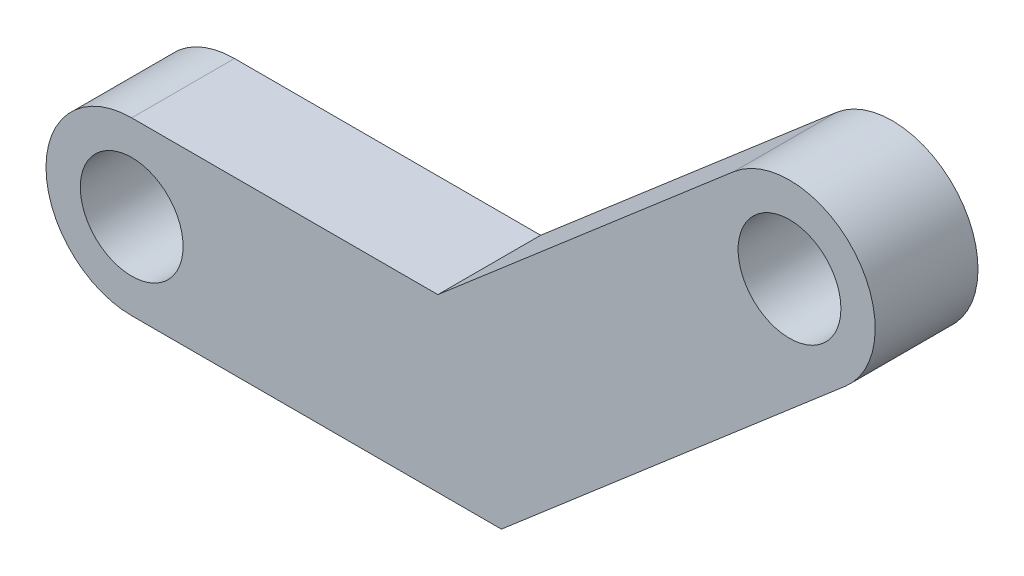
ISO-10303-21;
HEADER;
FILE_DESCRIPTION(('STEP AP214'),'2;1');
FILE_NAME('part.step','',(''),(''),'','','');
FILE_SCHEMA(('AUTOMOTIVE_DESIGN { 1 0 10303 214 1 1 1 1 }'));
ENDSEC;
DATA;
#1=APPLICATION_CONTEXT('core data for automotive mechanical design processes');
#2=APPLICATION_PROTOCOL_DEFINITION('international standard','automotive_design',2000,#1);
#3=PRODUCT_CONTEXT('',#1,'mechanical');
#4=PRODUCT('Part','Part','',(#3));
#5=PRODUCT_RELATED_PRODUCT_CATEGORY('part','',(#4));
#6=PRODUCT_DEFINITION_FORMATION('','',#4);
#7=PRODUCT_DEFINITION_CONTEXT('part definition',#1,'design');
#8=PRODUCT_DEFINITION('design','',#6,#7);
#9=PRODUCT_DEFINITION_SHAPE('','',#8);
#10=(LENGTH_UNIT() NAMED_UNIT(*) SI_UNIT(.MILLI.,.METRE.));
#11=(NAMED_UNIT(*) PLANE_ANGLE_UNIT() SI_UNIT($,.RADIAN.));
#12=(NAMED_UNIT(*) SI_UNIT($,.STERADIAN.) SOLID_ANGLE_UNIT());
#13=UNCERTAINTY_MEASURE_WITH_UNIT(LENGTH_MEASURE(1.E-05),#10,'distance_accuracy_value','');
#14=(GEOMETRIC_REPRESENTATION_CONTEXT(3) GLOBAL_UNCERTAINTY_ASSIGNED_CONTEXT((#13)) GLOBAL_UNIT_ASSIGNED_CONTEXT((#10,
#11,#12)) REPRESENTATION_CONTEXT('',''));
#15=CARTESIAN_POINT('',(0.,0.,0.));
#16=DIRECTION('',(0.,0.,1.));
#17=DIRECTION('',(1.,0.,0.));
#18=AXIS2_PLACEMENT_3D('',#15,#16,#17);
#19=CARTESIAN_POINT('',(3.87773986725271,0.,3.));
#20=DIRECTION('',(0.,0.,-1.));
#21=DIRECTION('',(-1.,0.,0.));
#22=AXIS2_PLACEMENT_3D('',#19,#20,#21);
#23=PLANE('',#22);
#24=CARTESIAN_POINT('',(3.87773986725271,0.,3.));
#25=DIRECTION('',(0.,0.,1.));
#26=DIRECTION('',(-1.,0.,0.));
#27=AXIS2_PLACEMENT_3D('',#24,#25,#26);
#28=CIRCLE('',#27,2.5);
#29=CARTESIAN_POINT('',(3.87773986725271,2.5,3.));
#30=VERTEX_POINT('',#29);
#31=CARTESIAN_POINT('',(3.87773986725271,-2.5,3.));
#32=VERTEX_POINT('',#31);
#33=EDGE_CURVE('E131',#30,#32,#28,.T.);
#34=ORIENTED_EDGE('',*,*,#33,.T.);
#35=DIRECTION('',(1.,0.,0.));
#36=VECTOR('',#35,1.);
#37=CARTESIAN_POINT('',(3.87773986725271,-2.5,3.));
#38=LINE('',#37,#36);
#39=CARTESIAN_POINT('',(14.6647507661521,-2.5,3.));
#40=VERTEX_POINT('',#39);
#41=EDGE_CURVE('E89',#32,#40,#38,.T.);
#42=ORIENTED_EDGE('',*,*,#41,.T.);
#43=DIRECTION('',(0.758248137291966,0.651966074495648,0.));
#44=VECTOR('',#43,1.);
#45=CARTESIAN_POINT('',(14.6647507661521,-2.5,3.));
#46=LINE('',#45,#44);
#47=CARTESIAN_POINT('',(24.7016896235559,6.13008203381151,3.));
#48=VERTEX_POINT('',#47);
#49=EDGE_CURVE('E102',#40,#48,#46,.T.);
#50=ORIENTED_EDGE('',*,*,#49,.T.);
#51=CARTESIAN_POINT('',(23.0717744373168,8.02570237704142,3.));
#52=DIRECTION('',(0.,0.,1.));
#53=DIRECTION('',(1.,0.,0.));
#54=AXIS2_PLACEMENT_3D('',#51,#52,#53);
#55=CIRCLE('',#54,2.5);
#56=CARTESIAN_POINT('',(21.4418592510777,9.92132272027134,3.));
#57=VERTEX_POINT('',#56);
#58=EDGE_CURVE('E96',#48,#57,#55,.T.);
#59=ORIENTED_EDGE('',*,*,#58,.T.);
#60=DIRECTION('',(-0.758248137291966,-0.651966074495647,0.));
#61=VECTOR('',#60,1.);
#62=CARTESIAN_POINT('',(12.8107289683534,2.5,3.));
#63=LINE('',#62,#61);
#64=CARTESIAN_POINT('',(12.8107289683534,2.5,3.));
#65=VERTEX_POINT('',#64);
#66=EDGE_CURVE('E100',#57,#65,#63,.T.);
#67=ORIENTED_EDGE('',*,*,#66,.T.);
#68=DIRECTION('',(-1.,0.,0.));
#69=VECTOR('',#68,1.);
#70=CARTESIAN_POINT('',(3.87773986725271,2.5,3.));
#71=LINE('',#70,#69);
#72=EDGE_CURVE('E52',#65,#30,#71,.T.);
#73=ORIENTED_EDGE('',*,*,#72,.T.);
#74=EDGE_LOOP('',(#34,#42,#50,#59,#67,#73));
#75=FACE_BOUND('',#74,.T.);
#76=CARTESIAN_POINT('',(23.0717744373168,8.02570237704142,3.));
#77=DIRECTION('',(0.,0.,1.));
#78=DIRECTION('',(1.,0.,0.));
#79=AXIS2_PLACEMENT_3D('',#76,#77,#78);
#80=CIRCLE('',#79,1.5);
#81=CARTESIAN_POINT('',(24.5717744373168,8.02570237704142,3.));
#82=VERTEX_POINT('',#81);
#83=EDGE_CURVE('E124',#82,#82,#80,.T.);
#84=ORIENTED_EDGE('',*,*,#83,.F.);
#85=EDGE_LOOP('',(#84));
#86=FACE_BOUND('',#85,.T.);
#87=CARTESIAN_POINT('',(3.87773986725271,0.,3.));
#88=DIRECTION('',(0.,0.,1.));
#89=DIRECTION('',(1.,0.,0.));
#90=AXIS2_PLACEMENT_3D('',#87,#88,#89);
#91=CIRCLE('',#90,1.5);
#92=CARTESIAN_POINT('',(5.37773986725271,0.,3.));
#93=VERTEX_POINT('',#92);
#94=EDGE_CURVE('E172',#93,#93,#91,.T.);
#95=ORIENTED_EDGE('',*,*,#94,.F.);
#96=EDGE_LOOP('',(#95));
#97=FACE_BOUND('',#96,.T.);
#98=ADVANCED_FACE('F35',(#75,#86,#97),#23,.F.);
#99=CARTESIAN_POINT('',(3.87773986725271,0.,0.));
#100=DIRECTION('',(0.,0.,-1.));
#101=DIRECTION('',(-1.,0.,0.));
#102=AXIS2_PLACEMENT_3D('',#99,#100,#101);
#103=PLANE('',#102);
#104=CARTESIAN_POINT('',(23.0717744373168,8.02570237704142,0.));
#105=DIRECTION('',(0.,0.,1.));
#106=DIRECTION('',(1.,0.,0.));
#107=AXIS2_PLACEMENT_3D('',#104,#105,#106);
#108=CIRCLE('',#107,1.5);
#109=CARTESIAN_POINT('',(24.5717744373168,8.02570237704142,0.));
#110=VERTEX_POINT('',#109);
#111=EDGE_CURVE('E177',#110,#110,#108,.T.);
#112=ORIENTED_EDGE('',*,*,#111,.T.);
#113=EDGE_LOOP('',(#112));
#114=FACE_BOUND('',#113,.T.);
#115=CARTESIAN_POINT('',(3.87773986725271,0.,0.));
#116=DIRECTION('',(0.,0.,1.));
#117=DIRECTION('',(-1.,0.,0.));
#118=AXIS2_PLACEMENT_3D('',#115,#116,#117);
#119=CIRCLE('',#118,2.5);
#120=CARTESIAN_POINT('',(3.87773986725271,2.5,0.));
#121=VERTEX_POINT('',#120);
#122=CARTESIAN_POINT('',(3.87773986725271,-2.5,0.));
#123=VERTEX_POINT('',#122);
#124=EDGE_CURVE('E120',#121,#123,#119,.T.);
#125=ORIENTED_EDGE('',*,*,#124,.F.);
#126=DIRECTION('',(-1.,0.,0.));
#127=VECTOR('',#126,1.);
#128=CARTESIAN_POINT('',(3.87773986725271,2.5,0.));
#129=LINE('',#128,#127);
#130=CARTESIAN_POINT('',(12.8107289683534,2.5,0.));
#131=VERTEX_POINT('',#130);
#132=EDGE_CURVE('E81',#131,#121,#129,.T.);
#133=ORIENTED_EDGE('',*,*,#132,.F.);
#134=DIRECTION('',(-0.758248137291966,-0.651966074495647,0.));
#135=VECTOR('',#134,1.);
#136=CARTESIAN_POINT('',(12.8107289683534,2.5,0.));
#137=LINE('',#136,#135);
#138=CARTESIAN_POINT('',(21.4418592510777,9.92132272027134,0.));
#139=VERTEX_POINT('',#138);
#140=EDGE_CURVE('E75',#139,#131,#137,.T.);
#141=ORIENTED_EDGE('',*,*,#140,.F.);
#142=CARTESIAN_POINT('',(23.0717744373168,8.02570237704142,0.));
#143=DIRECTION('',(0.,0.,1.));
#144=DIRECTION('',(1.,0.,0.));
#145=AXIS2_PLACEMENT_3D('',#142,#143,#144);
#146=CIRCLE('',#145,2.5);
#147=CARTESIAN_POINT('',(24.7016896235559,6.13008203381151,0.));
#148=VERTEX_POINT('',#147);
#149=EDGE_CURVE('E110',#148,#139,#146,.T.);
#150=ORIENTED_EDGE('',*,*,#149,.F.);
#151=DIRECTION('',(0.758248137291966,0.651966074495648,0.));
#152=VECTOR('',#151,1.);
#153=CARTESIAN_POINT('',(14.6647507661521,-2.5,0.));
#154=LINE('',#153,#152);
#155=CARTESIAN_POINT('',(14.6647507661521,-2.5,0.));
#156=VERTEX_POINT('',#155);
#157=EDGE_CURVE('E126',#156,#148,#154,.T.);
#158=ORIENTED_EDGE('',*,*,#157,.F.);
#159=DIRECTION('',(1.,0.,0.));
#160=VECTOR('',#159,1.);
#161=CARTESIAN_POINT('',(3.87773986725271,-2.5,0.));
#162=LINE('',#161,#160);
#163=EDGE_CURVE('E123',#123,#156,#162,.T.);
#164=ORIENTED_EDGE('',*,*,#163,.F.);
#165=EDGE_LOOP('',(#125,#133,#141,#150,#158,#164));
#166=FACE_BOUND('',#165,.T.);
#167=CARTESIAN_POINT('',(3.87773986725271,0.,0.));
#168=DIRECTION('',(0.,0.,1.));
#169=DIRECTION('',(1.,0.,0.));
#170=AXIS2_PLACEMENT_3D('',#167,#168,#169);
#171=CIRCLE('',#170,1.5);
#172=CARTESIAN_POINT('',(5.37773986725271,0.,0.));
#173=VERTEX_POINT('',#172);
#174=EDGE_CURVE('E175',#173,#173,#171,.T.);
#175=ORIENTED_EDGE('',*,*,#174,.T.);
#176=EDGE_LOOP('',(#175));
#177=FACE_BOUND('',#176,.T.);
#178=ADVANCED_FACE('F140',(#114,#166,#177),#103,.T.);
#179=CARTESIAN_POINT('',(3.87773986725271,0.,3.));
#180=DIRECTION('',(0.,0.,-1.));
#181=DIRECTION('',(-1.,0.,0.));
#182=AXIS2_PLACEMENT_3D('',#179,#180,#181);
#183=CYLINDRICAL_SURFACE('',#182,2.5);
#184=ORIENTED_EDGE('',*,*,#124,.T.);
#185=DIRECTION('',(0.,0.,-1.));
#186=VECTOR('',#185,1.);
#187=CARTESIAN_POINT('',(3.87773986725271,-2.5,3.));
#188=LINE('',#187,#186);
#189=EDGE_CURVE('E11',#32,#123,#188,.T.);
#190=ORIENTED_EDGE('',*,*,#189,.F.);
#191=ORIENTED_EDGE('',*,*,#33,.F.);
#192=DIRECTION('',(0.,0.,-1.));
#193=VECTOR('',#192,1.);
#194=CARTESIAN_POINT('',(3.87773986725271,2.5,3.));
#195=LINE('',#194,#193);
#196=EDGE_CURVE('E116',#30,#121,#195,.T.);
#197=ORIENTED_EDGE('',*,*,#196,.T.);
#198=EDGE_LOOP('',(#184,#190,#191,#197));
#199=FACE_BOUND('',#198,.T.);
#200=ADVANCED_FACE('F37',(#199),#183,.T.);
#201=CARTESIAN_POINT('',(3.87773986725271,-2.5,3.));
#202=DIRECTION('',(0.,1.,0.));
#203=DIRECTION('',(0.,0.,1.));
#204=AXIS2_PLACEMENT_3D('',#201,#202,#203);
#205=PLANE('',#204);
#206=ORIENTED_EDGE('',*,*,#163,.T.);
#207=DIRECTION('',(0.,0.,-1.));
#208=VECTOR('',#207,1.);
#209=CARTESIAN_POINT('',(14.6647507661521,-2.5,3.));
#210=LINE('',#209,#208);
#211=EDGE_CURVE('E44',#40,#156,#210,.T.);
#212=ORIENTED_EDGE('',*,*,#211,.F.);
#213=ORIENTED_EDGE('',*,*,#41,.F.);
#214=ORIENTED_EDGE('',*,*,#189,.T.);
#215=EDGE_LOOP('',(#206,#212,#213,#214));
#216=FACE_BOUND('',#215,.T.);
#217=ADVANCED_FACE('F220',(#216),#205,.F.);
#218=CARTESIAN_POINT('',(14.6647507661521,-2.5,3.));
#219=DIRECTION('',(-0.651966074495648,0.758248137291966,0.));
#220=DIRECTION('',(-0.758248137291966,-0.651966074495648,0.));
#221=AXIS2_PLACEMENT_3D('',#218,#219,#220);
#222=PLANE('',#221);
#223=ORIENTED_EDGE('',*,*,#157,.T.);
#224=DIRECTION('',(0.,0.,-1.));
#225=VECTOR('',#224,1.);
#226=CARTESIAN_POINT('',(24.7016896235559,6.13008203381151,3.));
#227=LINE('',#226,#225);
#228=EDGE_CURVE('E111',#48,#148,#227,.T.);
#229=ORIENTED_EDGE('',*,*,#228,.F.);
#230=ORIENTED_EDGE('',*,*,#49,.F.);
#231=ORIENTED_EDGE('',*,*,#211,.T.);
#232=EDGE_LOOP('',(#223,#229,#230,#231));
#233=FACE_BOUND('',#232,.T.);
#234=ADVANCED_FACE('F137',(#233),#222,.F.);
#235=CARTESIAN_POINT('',(23.0717744373168,8.02570237704142,3.));
#236=DIRECTION('',(0.,0.,-1.));
#237=DIRECTION('',(-1.,0.,0.));
#238=AXIS2_PLACEMENT_3D('',#235,#236,#237);
#239=CYLINDRICAL_SURFACE('',#238,2.5);
#240=ORIENTED_EDGE('',*,*,#149,.T.);
#241=DIRECTION('',(0.,0.,-1.));
#242=VECTOR('',#241,1.);
#243=CARTESIAN_POINT('',(21.4418592510777,9.92132272027134,3.));
#244=LINE('',#243,#242);
#245=EDGE_CURVE('E107',#57,#139,#244,.T.);
#246=ORIENTED_EDGE('',*,*,#245,.F.);
#247=ORIENTED_EDGE('',*,*,#58,.F.);
#248=ORIENTED_EDGE('',*,*,#228,.T.);
#249=EDGE_LOOP('',(#240,#246,#247,#248));
#250=FACE_BOUND('',#249,.T.);
#251=ADVANCED_FACE('F108',(#250),#239,.T.);
#252=CARTESIAN_POINT('',(12.8107289683534,2.5,3.));
#253=DIRECTION('',(0.651966074495647,-0.758248137291966,0.));
#254=DIRECTION('',(0.758248137291966,0.651966074495647,0.));
#255=AXIS2_PLACEMENT_3D('',#252,#253,#254);
#256=PLANE('',#255);
#257=ORIENTED_EDGE('',*,*,#140,.T.);
#258=DIRECTION('',(0.,0.,-1.));
#259=VECTOR('',#258,1.);
#260=CARTESIAN_POINT('',(12.8107289683534,2.5,3.));
#261=LINE('',#260,#259);
#262=EDGE_CURVE('E112',#65,#131,#261,.T.);
#263=ORIENTED_EDGE('',*,*,#262,.F.);
#264=ORIENTED_EDGE('',*,*,#66,.F.);
#265=ORIENTED_EDGE('',*,*,#245,.T.);
#266=EDGE_LOOP('',(#257,#263,#264,#265));
#267=FACE_BOUND('',#266,.T.);
#268=ADVANCED_FACE('F114',(#267),#256,.F.);
#269=CARTESIAN_POINT('',(3.87773986725271,2.5,3.));
#270=DIRECTION('',(0.,-1.,0.));
#271=DIRECTION('',(0.,0.,-1.));
#272=AXIS2_PLACEMENT_3D('',#269,#270,#271);
#273=PLANE('',#272);
#274=ORIENTED_EDGE('',*,*,#132,.T.);
#275=ORIENTED_EDGE('',*,*,#196,.F.);
#276=ORIENTED_EDGE('',*,*,#72,.F.);
#277=ORIENTED_EDGE('',*,*,#262,.T.);
#278=EDGE_LOOP('',(#274,#275,#276,#277));
#279=FACE_BOUND('',#278,.T.);
#280=ADVANCED_FACE('F145',(#279),#273,.F.);
#281=CARTESIAN_POINT('',(23.0717744373168,8.02570237704142,3.));
#282=DIRECTION('',(0.,0.,-1.));
#283=DIRECTION('',(-1.,0.,0.));
#284=AXIS2_PLACEMENT_3D('',#281,#282,#283);
#285=CYLINDRICAL_SURFACE('',#284,1.5);
#286=ORIENTED_EDGE('',*,*,#83,.T.);
#287=EDGE_LOOP('',(#286));
#288=FACE_BOUND('',#287,.T.);
#289=ORIENTED_EDGE('',*,*,#111,.F.);
#290=EDGE_LOOP('',(#289));
#291=FACE_BOUND('',#290,.T.);
#292=ADVANCED_FACE('F147',(#288,#291),#285,.F.);
#293=CARTESIAN_POINT('',(3.87773986725271,0.,3.));
#294=DIRECTION('',(0.,0.,-1.));
#295=DIRECTION('',(-1.,0.,0.));
#296=AXIS2_PLACEMENT_3D('',#293,#294,#295);
#297=CYLINDRICAL_SURFACE('',#296,1.5);
#298=ORIENTED_EDGE('',*,*,#94,.T.);
#299=EDGE_LOOP('',(#298));
#300=FACE_BOUND('',#299,.T.);
#301=ORIENTED_EDGE('',*,*,#174,.F.);
#302=EDGE_LOOP('',(#301));
#303=FACE_BOUND('',#302,.T.);
#304=ADVANCED_FACE('F153',(#300,#303),#297,.F.);
#305=CLOSED_SHELL('',(#98,#178,#200,#217,#234,#251,#268,#280,#292,#304));
#306=MANIFOLD_SOLID_BREP('B2',#305);
#307=ADVANCED_BREP_SHAPE_REPRESENTATION('',(#18,#306),#14);
#308=SHAPE_DEFINITION_REPRESENTATION(#9,#307);
ENDSEC;
END-ISO-10303-21;
